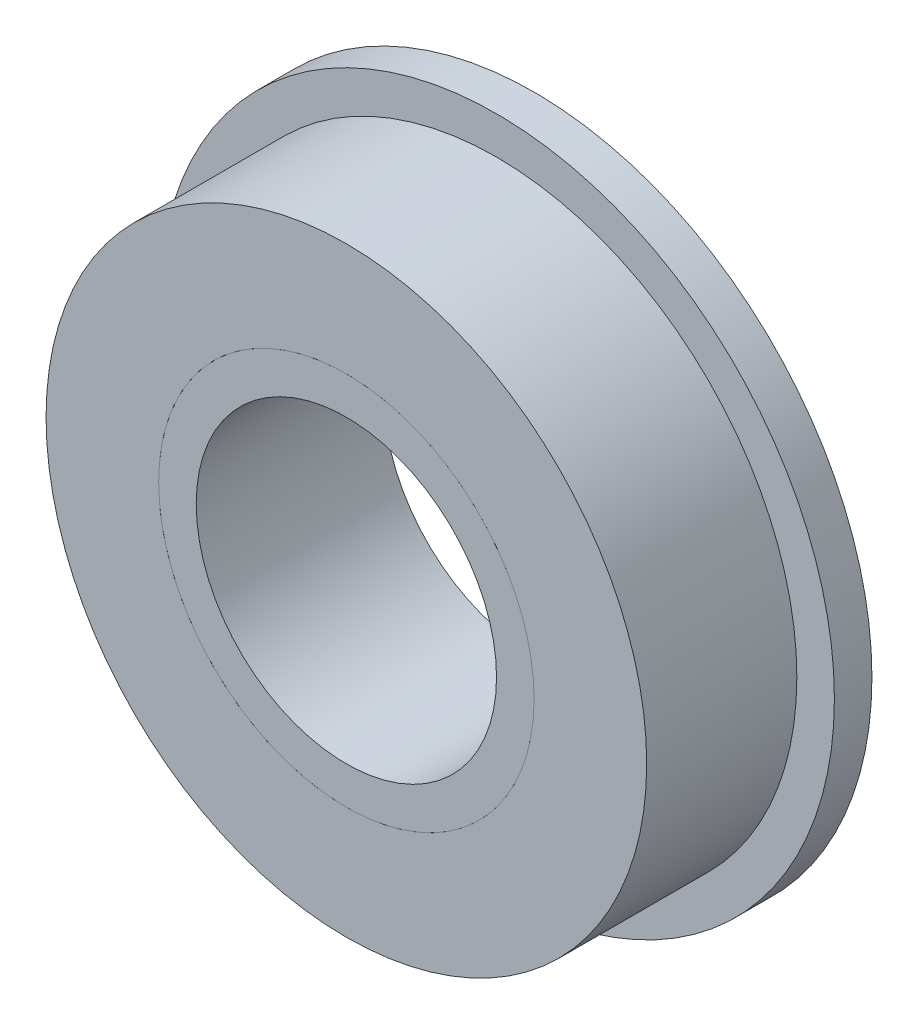
ISO-10303-21;
HEADER;
FILE_DESCRIPTION(('STEP AP214'),'2;1');
FILE_NAME('part.step','',(''),(''),'','','');
FILE_SCHEMA(('AUTOMOTIVE_DESIGN { 1 0 10303 214 1 1 1 1 }'));
ENDSEC;
DATA;
#1=APPLICATION_CONTEXT('core data for automotive mechanical design processes');
#2=APPLICATION_PROTOCOL_DEFINITION('international standard','automotive_design',2000,#1);
#3=PRODUCT_CONTEXT('',#1,'mechanical');
#4=PRODUCT('Part','Part','',(#3));
#5=PRODUCT_RELATED_PRODUCT_CATEGORY('part','',(#4));
#6=PRODUCT_DEFINITION_FORMATION('','',#4);
#7=PRODUCT_DEFINITION_CONTEXT('part definition',#1,'design');
#8=PRODUCT_DEFINITION('design','',#6,#7);
#9=PRODUCT_DEFINITION_SHAPE('','',#8);
#10=(LENGTH_UNIT() NAMED_UNIT(*) SI_UNIT(.MILLI.,.METRE.));
#11=(NAMED_UNIT(*) PLANE_ANGLE_UNIT() SI_UNIT($,.RADIAN.));
#12=(NAMED_UNIT(*) SI_UNIT($,.STERADIAN.) SOLID_ANGLE_UNIT());
#13=UNCERTAINTY_MEASURE_WITH_UNIT(LENGTH_MEASURE(1.E-05),#10,'distance_accuracy_value','');
#14=(GEOMETRIC_REPRESENTATION_CONTEXT(3) GLOBAL_UNCERTAINTY_ASSIGNED_CONTEXT((#13)) GLOBAL_UNIT_ASSIGNED_CONTEXT((#10,
#11,#12)) REPRESENTATION_CONTEXT('',''));
#15=CARTESIAN_POINT('',(0.,0.,0.));
#16=DIRECTION('',(0.,0.,1.));
#17=DIRECTION('',(1.,0.,0.));
#18=AXIS2_PLACEMENT_3D('',#15,#16,#17);
#19=CARTESIAN_POINT('',(0.,0.,19.142135623731));
#20=DIRECTION('',(0.,0.,-1.));
#21=DIRECTION('',(-1.,0.,0.));
#22=AXIS2_PLACEMENT_3D('',#19,#20,#21);
#23=CYLINDRICAL_SURFACE('',#22,5.);
#24=CARTESIAN_POINT('',(0.,0.,0.));
#25=DIRECTION('',(0.,0.,-1.));
#26=DIRECTION('',(-1.,0.,0.));
#27=AXIS2_PLACEMENT_3D('',#24,#25,#26);
#28=CIRCLE('',#27,5.);
#29=CARTESIAN_POINT('',(-5.,0.,0.));
#30=VERTEX_POINT('',#29);
#31=EDGE_CURVE('E51',#30,#30,#28,.T.);
#32=ORIENTED_EDGE('',*,*,#31,.F.);
#33=EDGE_LOOP('',(#32));
#34=FACE_BOUND('',#33,.T.);
#35=CARTESIAN_POINT('',(0.,0.,5.));
#36=DIRECTION('',(0.,0.,1.));
#37=DIRECTION('',(1.,0.,0.));
#38=AXIS2_PLACEMENT_3D('',#35,#36,#37);
#39=CIRCLE('',#38,5.);
#40=CARTESIAN_POINT('',(5.,0.,5.));
#41=VERTEX_POINT('',#40);
#42=EDGE_CURVE('E60',#41,#41,#39,.F.);
#43=ORIENTED_EDGE('',*,*,#42,.T.);
#44=EDGE_LOOP('',(#43));
#45=FACE_BOUND('',#44,.T.);
#46=ADVANCED_FACE('F44',(#34,#45),#23,.T.);
#47=CARTESIAN_POINT('',(0.,0.,19.142135623731));
#48=DIRECTION('',(0.,0.,-1.));
#49=DIRECTION('',(-1.,0.,0.));
#50=AXIS2_PLACEMENT_3D('',#47,#48,#49);
#51=CYLINDRICAL_SURFACE('',#50,4.);
#52=CARTESIAN_POINT('',(0.,0.,0.));
#53=DIRECTION('',(0.,0.,-1.));
#54=DIRECTION('',(-1.,0.,0.));
#55=AXIS2_PLACEMENT_3D('',#52,#53,#54);
#56=CIRCLE('',#55,4.);
#57=CARTESIAN_POINT('',(-4.,0.,0.));
#58=VERTEX_POINT('',#57);
#59=EDGE_CURVE('E55',#58,#58,#56,.T.);
#60=ORIENTED_EDGE('',*,*,#59,.T.);
#61=EDGE_LOOP('',(#60));
#62=FACE_BOUND('',#61,.T.);
#63=CARTESIAN_POINT('',(0.,0.,5.));
#64=DIRECTION('',(0.,0.,1.));
#65=DIRECTION('',(1.,0.,0.));
#66=AXIS2_PLACEMENT_3D('',#63,#64,#65);
#67=CIRCLE('',#66,4.);
#68=CARTESIAN_POINT('',(4.,0.,5.));
#69=VERTEX_POINT('',#68);
#70=EDGE_CURVE('E11',#69,#69,#67,.F.);
#71=ORIENTED_EDGE('',*,*,#70,.F.);
#72=EDGE_LOOP('',(#71));
#73=FACE_BOUND('',#72,.T.);
#74=ADVANCED_FACE('F71',(#62,#73),#51,.F.);
#75=CARTESIAN_POINT('',(0.,0.,0.));
#76=DIRECTION('',(0.,0.,-1.));
#77=DIRECTION('',(-1.,0.,0.));
#78=AXIS2_PLACEMENT_3D('',#75,#76,#77);
#79=PLANE('',#78);
#80=ORIENTED_EDGE('',*,*,#59,.F.);
#81=EDGE_LOOP('',(#80));
#82=FACE_BOUND('',#81,.T.);
#83=ORIENTED_EDGE('',*,*,#31,.T.);
#84=EDGE_LOOP('',(#83));
#85=FACE_BOUND('',#84,.T.);
#86=ADVANCED_FACE('F67',(#82,#85),#79,.T.);
#87=CARTESIAN_POINT('',(0.,0.,5.));
#88=DIRECTION('',(0.,0.,1.));
#89=DIRECTION('',(1.,0.,0.));
#90=AXIS2_PLACEMENT_3D('',#87,#88,#89);
#91=PLANE('',#90);
#92=ORIENTED_EDGE('',*,*,#42,.F.);
#93=EDGE_LOOP('',(#92));
#94=FACE_BOUND('',#93,.T.);
#95=ORIENTED_EDGE('',*,*,#70,.T.);
#96=EDGE_LOOP('',(#95));
#97=FACE_BOUND('',#96,.T.);
#98=ADVANCED_FACE('F46',(#94,#97),#91,.T.);
#99=CLOSED_SHELL('',(#46,#74,#86,#98));
#100=MANIFOLD_SOLID_BREP('B2',#99);
#101=CARTESIAN_POINT('',(0.,0.,5.));
#102=DIRECTION('',(0.,0.,1.));
#103=DIRECTION('',(1.,0.,0.));
#104=AXIS2_PLACEMENT_3D('',#101,#102,#103);
#105=PLANE('',#104);
#106=CARTESIAN_POINT('',(0.,0.,5.));
#107=DIRECTION('',(0.,0.,1.));
#108=DIRECTION('',(1.,0.,0.));
#109=AXIS2_PLACEMENT_3D('',#106,#107,#108);
#110=CIRCLE('',#109,5.);
#111=CARTESIAN_POINT('',(5.,0.,5.));
#112=VERTEX_POINT('',#111);
#113=EDGE_CURVE('E120',#112,#112,#110,.T.);
#114=ORIENTED_EDGE('',*,*,#113,.F.);
#115=EDGE_LOOP('',(#114));
#116=FACE_BOUND('',#115,.T.);
#117=CARTESIAN_POINT('',(0.,0.,5.));
#118=DIRECTION('',(0.,0.,1.));
#119=DIRECTION('',(1.,0.,0.));
#120=AXIS2_PLACEMENT_3D('',#117,#118,#119);
#121=CIRCLE('',#120,8.);
#122=CARTESIAN_POINT('',(8.,0.,5.));
#123=VERTEX_POINT('',#122);
#124=EDGE_CURVE('E134',#123,#123,#121,.T.);
#125=ORIENTED_EDGE('',*,*,#124,.T.);
#126=EDGE_LOOP('',(#125));
#127=FACE_BOUND('',#126,.T.);
#128=ADVANCED_FACE('F113',(#116,#127),#105,.T.);
#129=CARTESIAN_POINT('',(0.,0.,5.));
#130=DIRECTION('',(0.,0.,-1.));
#131=DIRECTION('',(-1.,0.,0.));
#132=AXIS2_PLACEMENT_3D('',#129,#130,#131);
#133=CYLINDRICAL_SURFACE('',#132,9.);
#134=CARTESIAN_POINT('',(0.,0.,0.));
#135=DIRECTION('',(0.,0.,1.));
#136=DIRECTION('',(1.,0.,0.));
#137=AXIS2_PLACEMENT_3D('',#134,#135,#136);
#138=CIRCLE('',#137,9.);
#139=CARTESIAN_POINT('',(9.,0.,0.));
#140=VERTEX_POINT('',#139);
#141=EDGE_CURVE('E43',#140,#140,#138,.T.);
#142=ORIENTED_EDGE('',*,*,#141,.T.);
#143=EDGE_LOOP('',(#142));
#144=FACE_BOUND('',#143,.T.);
#145=CARTESIAN_POINT('',(0.,0.,1.));
#146=DIRECTION('',(0.,0.,1.));
#147=DIRECTION('',(1.,0.,0.));
#148=AXIS2_PLACEMENT_3D('',#145,#146,#147);
#149=CIRCLE('',#148,9.);
#150=CARTESIAN_POINT('',(9.,0.,1.));
#151=VERTEX_POINT('',#150);
#152=EDGE_CURVE('E129',#151,#151,#149,.F.);
#153=ORIENTED_EDGE('',*,*,#152,.T.);
#154=EDGE_LOOP('',(#153));
#155=FACE_BOUND('',#154,.T.);
#156=ADVANCED_FACE('F115',(#144,#155),#133,.T.);
#157=CARTESIAN_POINT('',(0.,0.,0.));
#158=DIRECTION('',(0.,0.,1.));
#159=DIRECTION('',(1.,0.,0.));
#160=AXIS2_PLACEMENT_3D('',#157,#158,#159);
#161=PLANE('',#160);
#162=ORIENTED_EDGE('',*,*,#141,.F.);
#163=EDGE_LOOP('',(#162));
#164=FACE_BOUND('',#163,.T.);
#165=CARTESIAN_POINT('',(0.,0.,0.));
#166=DIRECTION('',(0.,0.,1.));
#167=DIRECTION('',(1.,0.,0.));
#168=AXIS2_PLACEMENT_3D('',#165,#166,#167);
#169=CIRCLE('',#168,5.);
#170=CARTESIAN_POINT('',(5.,0.,0.));
#171=VERTEX_POINT('',#170);
#172=EDGE_CURVE('E124',#171,#171,#169,.T.);
#173=ORIENTED_EDGE('',*,*,#172,.T.);
#174=EDGE_LOOP('',(#173));
#175=FACE_BOUND('',#174,.T.);
#176=ADVANCED_FACE('F160',(#164,#175),#161,.F.);
#177=CARTESIAN_POINT('',(0.,0.,5.));
#178=DIRECTION('',(0.,0.,-1.));
#179=DIRECTION('',(-1.,0.,0.));
#180=AXIS2_PLACEMENT_3D('',#177,#178,#179);
#181=CYLINDRICAL_SURFACE('',#180,5.);
#182=ORIENTED_EDGE('',*,*,#113,.T.);
#183=EDGE_LOOP('',(#182));
#184=FACE_BOUND('',#183,.T.);
#185=ORIENTED_EDGE('',*,*,#172,.F.);
#186=EDGE_LOOP('',(#185));
#187=FACE_BOUND('',#186,.T.);
#188=ADVANCED_FACE('F150',(#184,#187),#181,.F.);
#189=CARTESIAN_POINT('',(0.,0.,-25.4558441227157));
#190=DIRECTION('',(0.,0.,1.));
#191=DIRECTION('',(1.,0.,0.));
#192=AXIS2_PLACEMENT_3D('',#189,#190,#191);
#193=CYLINDRICAL_SURFACE('',#192,8.);
#194=CARTESIAN_POINT('',(0.,0.,1.));
#195=DIRECTION('',(0.,0.,1.));
#196=DIRECTION('',(1.,0.,0.));
#197=AXIS2_PLACEMENT_3D('',#194,#195,#196);
#198=CIRCLE('',#197,8.);
#199=CARTESIAN_POINT('',(8.,0.,1.));
#200=VERTEX_POINT('',#199);
#201=EDGE_CURVE('E131',#200,#200,#198,.F.);
#202=ORIENTED_EDGE('',*,*,#201,.F.);
#203=EDGE_LOOP('',(#202));
#204=FACE_BOUND('',#203,.T.);
#205=ORIENTED_EDGE('',*,*,#124,.F.);
#206=EDGE_LOOP('',(#205));
#207=FACE_BOUND('',#206,.T.);
#208=ADVANCED_FACE('F144',(#204,#207),#193,.T.);
#209=CARTESIAN_POINT('',(0.,0.,1.));
#210=DIRECTION('',(0.,0.,1.));
#211=DIRECTION('',(1.,0.,0.));
#212=AXIS2_PLACEMENT_3D('',#209,#210,#211);
#213=PLANE('',#212);
#214=ORIENTED_EDGE('',*,*,#152,.F.);
#215=EDGE_LOOP('',(#214));
#216=FACE_BOUND('',#215,.T.);
#217=ORIENTED_EDGE('',*,*,#201,.T.);
#218=EDGE_LOOP('',(#217));
#219=FACE_BOUND('',#218,.T.);
#220=ADVANCED_FACE('F141',(#216,#219),#213,.T.);
#221=CLOSED_SHELL('',(#128,#156,#176,#188,#208,#220));
#222=MANIFOLD_SOLID_BREP('B6',#221);
#223=ADVANCED_BREP_SHAPE_REPRESENTATION('',(#18,#100,#222),#14);
#224=SHAPE_DEFINITION_REPRESENTATION(#9,#223);
ENDSEC;
END-ISO-10303-21;
